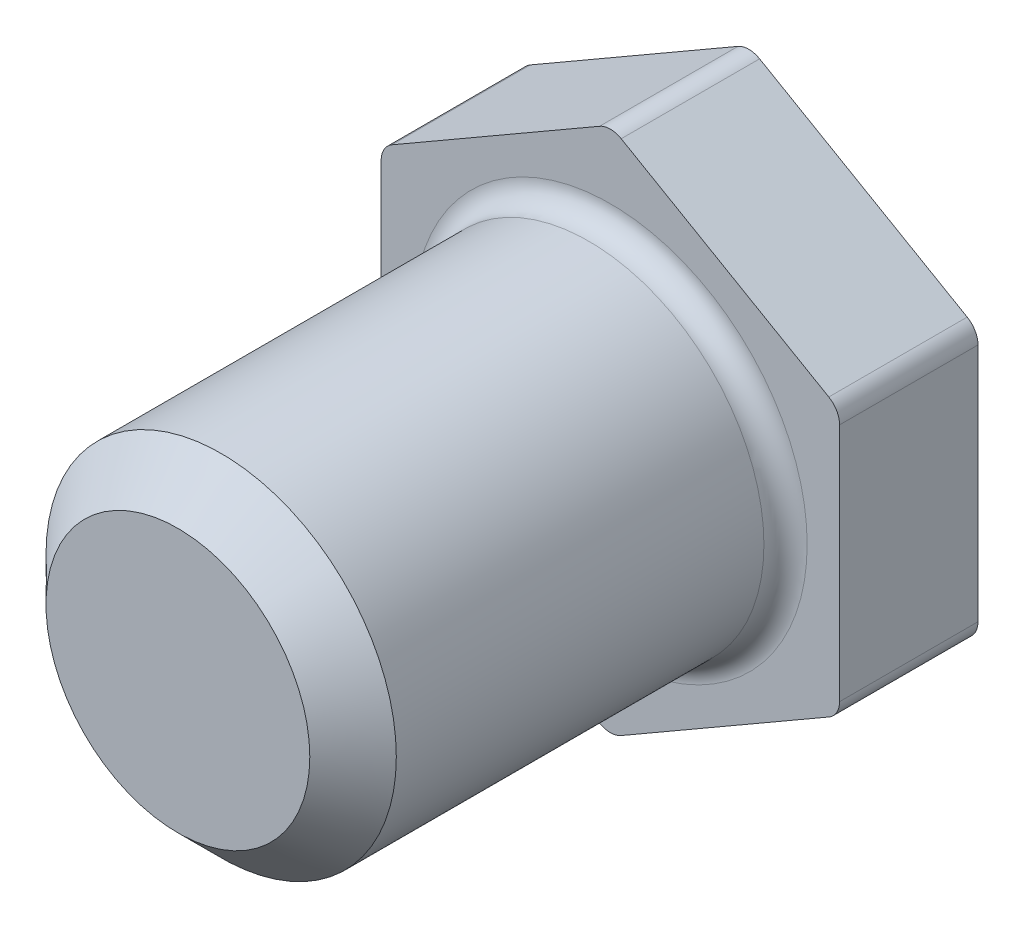
ISO-10303-21;
HEADER;
FILE_DESCRIPTION(('STEP AP214'),'2;1');
FILE_NAME('part.step','',(''),(''),'','','');
FILE_SCHEMA(('AUTOMOTIVE_DESIGN { 1 0 10303 214 1 1 1 1 }'));
ENDSEC;
DATA;
#1=APPLICATION_CONTEXT('core data for automotive mechanical design processes');
#2=APPLICATION_PROTOCOL_DEFINITION('international standard','automotive_design',2000,#1);
#3=PRODUCT_CONTEXT('',#1,'mechanical');
#4=PRODUCT('Part','Part','',(#3));
#5=PRODUCT_RELATED_PRODUCT_CATEGORY('part','',(#4));
#6=PRODUCT_DEFINITION_FORMATION('','',#4);
#7=PRODUCT_DEFINITION_CONTEXT('part definition',#1,'design');
#8=PRODUCT_DEFINITION('design','',#6,#7);
#9=PRODUCT_DEFINITION_SHAPE('','',#8);
#10=(LENGTH_UNIT() NAMED_UNIT(*) SI_UNIT(.MILLI.,.METRE.));
#11=(NAMED_UNIT(*) PLANE_ANGLE_UNIT() SI_UNIT($,.RADIAN.));
#12=(NAMED_UNIT(*) SI_UNIT($,.STERADIAN.) SOLID_ANGLE_UNIT());
#13=UNCERTAINTY_MEASURE_WITH_UNIT(LENGTH_MEASURE(1.E-05),#10,'distance_accuracy_value','');
#14=(GEOMETRIC_REPRESENTATION_CONTEXT(3) GLOBAL_UNCERTAINTY_ASSIGNED_CONTEXT((#13)) GLOBAL_UNIT_ASSIGNED_CONTEXT((#10,
#11,#12)) REPRESENTATION_CONTEXT('',''));
#15=CARTESIAN_POINT('',(0.,0.,0.));
#16=DIRECTION('',(0.,0.,1.));
#17=DIRECTION('',(1.,0.,0.));
#18=AXIS2_PLACEMENT_3D('',#15,#16,#17);
#19=CARTESIAN_POINT('',(5.3,-3.05995642670502,3.2));
#20=DIRECTION('',(-1.,0.,0.));
#21=DIRECTION('',(0.,-1.,0.));
#22=AXIS2_PLACEMENT_3D('',#19,#20,#21);
#23=PLANE('',#22);
#24=DIRECTION('',(0.,1.,0.));
#25=VECTOR('',#24,1.);
#26=CARTESIAN_POINT('',(5.3,-3.05995642670502,3.2));
#27=LINE('',#26,#25);
#28=CARTESIAN_POINT('',(5.3,-2.7712812921102,3.2));
#29=VERTEX_POINT('',#28);
#30=CARTESIAN_POINT('',(5.3,2.77128129211021,3.2));
#31=VERTEX_POINT('',#30);
#32=EDGE_CURVE('E145',#29,#31,#27,.T.);
#33=ORIENTED_EDGE('',*,*,#32,.F.);
#34=DIRECTION('',(0.,0.,-1.));
#35=VECTOR('',#34,1.);
#36=CARTESIAN_POINT('',(5.3,-2.7712812921102,3.2));
#37=LINE('',#36,#35);
#38=CARTESIAN_POINT('',(5.3,-2.7712812921102,0.));
#39=VERTEX_POINT('',#38);
#40=EDGE_CURVE('E159',#29,#39,#37,.T.);
#41=ORIENTED_EDGE('',*,*,#40,.T.);
#42=DIRECTION('',(0.,1.,0.));
#43=VECTOR('',#42,1.);
#44=CARTESIAN_POINT('',(5.3,-3.05995642670502,0.));
#45=LINE('',#44,#43);
#46=CARTESIAN_POINT('',(5.3,2.77128129211021,0.));
#47=VERTEX_POINT('',#46);
#48=EDGE_CURVE('E320',#39,#47,#45,.T.);
#49=ORIENTED_EDGE('',*,*,#48,.T.);
#50=DIRECTION('',(0.,0.,-1.));
#51=VECTOR('',#50,1.);
#52=CARTESIAN_POINT('',(5.3,2.77128129211021,3.2));
#53=LINE('',#52,#51);
#54=EDGE_CURVE('E161',#47,#31,#53,.F.);
#55=ORIENTED_EDGE('',*,*,#54,.T.);
#56=EDGE_LOOP('',(#33,#41,#49,#55));
#57=FACE_BOUND('',#56,.T.);
#58=ADVANCED_FACE('F47',(#57),#23,.F.);
#59=CARTESIAN_POINT('',(5.3,3.05995642670502,3.2));
#60=DIRECTION('',(-0.499999999999999,-0.866025403784439,0.));
#61=DIRECTION('',(0.866025403784439,-0.499999999999999,0.));
#62=AXIS2_PLACEMENT_3D('',#59,#60,#61);
#63=PLANE('',#62);
#64=DIRECTION('',(-0.866025403784439,0.499999999999999,0.));
#65=VECTOR('',#64,1.);
#66=CARTESIAN_POINT('',(5.3,3.05995642670502,3.2));
#67=LINE('',#66,#65);
#68=CARTESIAN_POINT('',(5.05,3.20429399400243,3.2));
#69=VERTEX_POINT('',#68);
#70=CARTESIAN_POINT('',(0.249999999999993,5.97557528611262,3.2));
#71=VERTEX_POINT('',#70);
#72=EDGE_CURVE('E163',#69,#71,#67,.T.);
#73=ORIENTED_EDGE('',*,*,#72,.F.);
#74=DIRECTION('',(0.,0.,-1.));
#75=VECTOR('',#74,1.);
#76=CARTESIAN_POINT('',(5.05,3.20429399400243,3.2));
#77=LINE('',#76,#75);
#78=CARTESIAN_POINT('',(5.05,3.20429399400243,0.));
#79=VERTEX_POINT('',#78);
#80=EDGE_CURVE('E173',#69,#79,#77,.T.);
#81=ORIENTED_EDGE('',*,*,#80,.T.);
#82=DIRECTION('',(-0.866025403784439,0.499999999999999,0.));
#83=VECTOR('',#82,1.);
#84=CARTESIAN_POINT('',(5.3,3.05995642670502,0.));
#85=LINE('',#84,#83);
#86=CARTESIAN_POINT('',(0.249999999999993,5.97557528611262,0.));
#87=VERTEX_POINT('',#86);
#88=EDGE_CURVE('E323',#79,#87,#85,.T.);
#89=ORIENTED_EDGE('',*,*,#88,.T.);
#90=DIRECTION('',(0.,0.,-1.));
#91=VECTOR('',#90,1.);
#92=CARTESIAN_POINT('',(0.249999999999993,5.97557528611262,3.2));
#93=LINE('',#92,#91);
#94=EDGE_CURVE('E169',#87,#71,#93,.F.);
#95=ORIENTED_EDGE('',*,*,#94,.T.);
#96=EDGE_LOOP('',(#73,#81,#89,#95));
#97=FACE_BOUND('',#96,.T.);
#98=ADVANCED_FACE('F197',(#97),#63,.F.);
#99=CARTESIAN_POINT('',(0.,6.11991285341003,3.2));
#100=DIRECTION('',(0.5,-0.866025403784438,0.));
#101=DIRECTION('',(0.866025403784439,0.5,0.));
#102=AXIS2_PLACEMENT_3D('',#99,#100,#101);
#103=PLANE('',#102);
#104=DIRECTION('',(-0.866025403784438,-0.5,0.));
#105=VECTOR('',#104,1.);
#106=CARTESIAN_POINT('',(0.,6.11991285341003,0.));
#107=LINE('',#106,#105);
#108=CARTESIAN_POINT('',(-0.250000000000006,5.97557528611262,0.));
#109=VERTEX_POINT('',#108);
#110=CARTESIAN_POINT('',(-5.05,3.20429399400242,0.));
#111=VERTEX_POINT('',#110);
#112=EDGE_CURVE('E326',#109,#111,#107,.T.);
#113=ORIENTED_EDGE('',*,*,#112,.T.);
#114=DIRECTION('',(0.,0.,-1.));
#115=VECTOR('',#114,1.);
#116=CARTESIAN_POINT('',(-5.05,3.20429399400242,3.2));
#117=LINE('',#116,#115);
#118=CARTESIAN_POINT('',(-5.05,3.20429399400242,3.2));
#119=VERTEX_POINT('',#118);
#120=EDGE_CURVE('E276',#111,#119,#117,.F.);
#121=ORIENTED_EDGE('',*,*,#120,.T.);
#122=DIRECTION('',(-0.866025403784438,-0.5,0.));
#123=VECTOR('',#122,1.);
#124=CARTESIAN_POINT('',(0.,6.11991285341003,3.2));
#125=LINE('',#124,#123);
#126=CARTESIAN_POINT('',(-0.250000000000006,5.97557528611262,3.2));
#127=VERTEX_POINT('',#126);
#128=EDGE_CURVE('E360',#127,#119,#125,.T.);
#129=ORIENTED_EDGE('',*,*,#128,.F.);
#130=DIRECTION('',(0.,0.,-1.));
#131=VECTOR('',#130,1.);
#132=CARTESIAN_POINT('',(-0.250000000000006,5.97557528611262,3.2));
#133=LINE('',#132,#131);
#134=EDGE_CURVE('E272',#127,#109,#133,.T.);
#135=ORIENTED_EDGE('',*,*,#134,.T.);
#136=EDGE_LOOP('',(#113,#121,#129,#135));
#137=FACE_BOUND('',#136,.T.);
#138=ADVANCED_FACE('F202',(#137),#103,.F.);
#139=CARTESIAN_POINT('',(-5.3,3.05995642670502,3.2));
#140=DIRECTION('',(1.,0.,0.));
#141=DIRECTION('',(0.,1.,0.));
#142=AXIS2_PLACEMENT_3D('',#139,#140,#141);
#143=PLANE('',#142);
#144=DIRECTION('',(0.,-1.,0.));
#145=VECTOR('',#144,1.);
#146=CARTESIAN_POINT('',(-5.3,3.05995642670502,3.2));
#147=LINE('',#146,#145);
#148=CARTESIAN_POINT('',(-5.3,2.7712812921102,3.2));
#149=VERTEX_POINT('',#148);
#150=CARTESIAN_POINT('',(-5.3,-2.77128129211021,3.2));
#151=VERTEX_POINT('',#150);
#152=EDGE_CURVE('E316',#149,#151,#147,.T.);
#153=ORIENTED_EDGE('',*,*,#152,.F.);
#154=DIRECTION('',(0.,0.,-1.));
#155=VECTOR('',#154,1.);
#156=CARTESIAN_POINT('',(-5.3,2.7712812921102,3.2));
#157=LINE('',#156,#155);
#158=CARTESIAN_POINT('',(-5.3,2.7712812921102,0.));
#159=VERTEX_POINT('',#158);
#160=EDGE_CURVE('E253',#149,#159,#157,.T.);
#161=ORIENTED_EDGE('',*,*,#160,.T.);
#162=DIRECTION('',(0.,-1.,0.));
#163=VECTOR('',#162,1.);
#164=CARTESIAN_POINT('',(-5.3,3.05995642670502,0.));
#165=LINE('',#164,#163);
#166=CARTESIAN_POINT('',(-5.3,-2.77128129211021,0.));
#167=VERTEX_POINT('',#166);
#168=EDGE_CURVE('E304',#159,#167,#165,.T.);
#169=ORIENTED_EDGE('',*,*,#168,.T.);
#170=DIRECTION('',(0.,0.,-1.));
#171=VECTOR('',#170,1.);
#172=CARTESIAN_POINT('',(-5.3,-2.77128129211021,3.2));
#173=LINE('',#172,#171);
#174=EDGE_CURVE('E250',#167,#151,#173,.F.);
#175=ORIENTED_EDGE('',*,*,#174,.T.);
#176=EDGE_LOOP('',(#153,#161,#169,#175));
#177=FACE_BOUND('',#176,.T.);
#178=ADVANCED_FACE('F334',(#177),#143,.F.);
#179=CARTESIAN_POINT('',(-5.3,-3.05995642670502,3.2));
#180=DIRECTION('',(0.499999999999999,0.866025403784439,0.));
#181=DIRECTION('',(-0.866025403784439,0.499999999999999,0.));
#182=AXIS2_PLACEMENT_3D('',#179,#180,#181);
#183=PLANE('',#182);
#184=DIRECTION('',(0.866025403784439,-0.499999999999999,0.));
#185=VECTOR('',#184,1.);
#186=CARTESIAN_POINT('',(-5.3,-3.05995642670502,3.2));
#187=LINE('',#186,#185);
#188=CARTESIAN_POINT('',(-5.05,-3.20429399400243,3.2));
#189=VERTEX_POINT('',#188);
#190=CARTESIAN_POINT('',(-0.249999999999999,-5.97557528611263,3.2));
#191=VERTEX_POINT('',#190);
#192=EDGE_CURVE('E312',#189,#191,#187,.T.);
#193=ORIENTED_EDGE('',*,*,#192,.F.);
#194=DIRECTION('',(0.,0.,-1.));
#195=VECTOR('',#194,1.);
#196=CARTESIAN_POINT('',(-5.05,-3.20429399400243,3.2));
#197=LINE('',#196,#195);
#198=CARTESIAN_POINT('',(-5.05,-3.20429399400243,0.));
#199=VERTEX_POINT('',#198);
#200=EDGE_CURVE('E282',#189,#199,#197,.T.);
#201=ORIENTED_EDGE('',*,*,#200,.T.);
#202=DIRECTION('',(0.866025403784439,-0.499999999999999,0.));
#203=VECTOR('',#202,1.);
#204=CARTESIAN_POINT('',(-5.3,-3.05995642670502,0.));
#205=LINE('',#204,#203);
#206=CARTESIAN_POINT('',(-0.249999999999999,-5.97557528611263,0.));
#207=VERTEX_POINT('',#206);
#208=EDGE_CURVE('E301',#199,#207,#205,.T.);
#209=ORIENTED_EDGE('',*,*,#208,.T.);
#210=DIRECTION('',(0.,0.,-1.));
#211=VECTOR('',#210,1.);
#212=CARTESIAN_POINT('',(-0.249999999999998,-5.97557528611263,3.2));
#213=LINE('',#212,#211);
#214=EDGE_CURVE('E279',#207,#191,#213,.F.);
#215=ORIENTED_EDGE('',*,*,#214,.T.);
#216=EDGE_LOOP('',(#193,#201,#209,#215));
#217=FACE_BOUND('',#216,.T.);
#218=ADVANCED_FACE('F341',(#217),#183,.F.);
#219=CARTESIAN_POINT('',(0.,-6.11991285341003,3.2));
#220=DIRECTION('',(-0.5,0.866025403784439,0.));
#221=DIRECTION('',(-0.866025403784439,-0.5,0.));
#222=AXIS2_PLACEMENT_3D('',#219,#220,#221);
#223=PLANE('',#222);
#224=DIRECTION('',(0.866025403784439,0.5,0.));
#225=VECTOR('',#224,1.);
#226=CARTESIAN_POINT('',(0.,-6.11991285341003,3.2));
#227=LINE('',#226,#225);
#228=CARTESIAN_POINT('',(0.250000000000002,-5.97557528611263,3.2));
#229=VERTEX_POINT('',#228);
#230=CARTESIAN_POINT('',(5.05,-3.20429399400242,3.2));
#231=VERTEX_POINT('',#230);
#232=EDGE_CURVE('E148',#229,#231,#227,.T.);
#233=ORIENTED_EDGE('',*,*,#232,.F.);
#234=DIRECTION('',(0.,0.,-1.));
#235=VECTOR('',#234,1.);
#236=CARTESIAN_POINT('',(0.250000000000002,-5.97557528611263,3.2));
#237=LINE('',#236,#235);
#238=CARTESIAN_POINT('',(0.250000000000002,-5.97557528611263,0.));
#239=VERTEX_POINT('',#238);
#240=EDGE_CURVE('E175',#229,#239,#237,.T.);
#241=ORIENTED_EDGE('',*,*,#240,.T.);
#242=DIRECTION('',(0.866025403784439,0.5,0.));
#243=VECTOR('',#242,1.);
#244=CARTESIAN_POINT('',(0.,-6.11991285341003,0.));
#245=LINE('',#244,#243);
#246=CARTESIAN_POINT('',(5.05,-3.20429399400242,0.));
#247=VERTEX_POINT('',#246);
#248=EDGE_CURVE('E164',#239,#247,#245,.T.);
#249=ORIENTED_EDGE('',*,*,#248,.T.);
#250=DIRECTION('',(0.,0.,-1.));
#251=VECTOR('',#250,1.);
#252=CARTESIAN_POINT('',(5.05,-3.20429399400242,3.2));
#253=LINE('',#252,#251);
#254=EDGE_CURVE('E286',#247,#231,#253,.F.);
#255=ORIENTED_EDGE('',*,*,#254,.T.);
#256=EDGE_LOOP('',(#233,#241,#249,#255));
#257=FACE_BOUND('',#256,.T.);
#258=ADVANCED_FACE('F294',(#257),#223,.F.);
#259=CARTESIAN_POINT('',(0.,0.,3.2));
#260=DIRECTION('',(0.,0.,1.));
#261=DIRECTION('',(1.,0.,0.));
#262=AXIS2_PLACEMENT_3D('',#259,#260,#261);
#263=PLANE('',#262);
#264=CARTESIAN_POINT('',(0.,0.,3.2));
#265=DIRECTION('',(0.,0.,1.));
#266=DIRECTION('',(1.,0.,0.));
#267=AXIS2_PLACEMENT_3D('',#264,#265,#266);
#268=CIRCLE('',#267,4.55);
#269=CARTESIAN_POINT('',(4.55,0.,3.2));
#270=VERTEX_POINT('',#269);
#271=EDGE_CURVE('E246',#270,#270,#268,.F.);
#272=ORIENTED_EDGE('',*,*,#271,.T.);
#273=EDGE_LOOP('',(#272));
#274=FACE_BOUND('',#273,.T.);
#275=ORIENTED_EDGE('',*,*,#128,.T.);
#276=CARTESIAN_POINT('',(-4.8,2.7712812921102,3.2));
#277=DIRECTION('',(0.,0.,1.));
#278=DIRECTION('',(1.,0.,0.));
#279=AXIS2_PLACEMENT_3D('',#276,#277,#278);
#280=CIRCLE('',#279,0.5);
#281=EDGE_CURVE('E243',#119,#149,#280,.T.);
#282=ORIENTED_EDGE('',*,*,#281,.T.);
#283=ORIENTED_EDGE('',*,*,#152,.T.);
#284=CARTESIAN_POINT('',(-4.8,-2.77128129211021,3.2));
#285=DIRECTION('',(0.,0.,1.));
#286=DIRECTION('',(1.,0.,0.));
#287=AXIS2_PLACEMENT_3D('',#284,#285,#286);
#288=CIRCLE('',#287,0.5);
#289=EDGE_CURVE('E240',#151,#189,#288,.T.);
#290=ORIENTED_EDGE('',*,*,#289,.T.);
#291=ORIENTED_EDGE('',*,*,#192,.T.);
#292=CARTESIAN_POINT('',(0.,-5.54256258422041,3.2));
#293=DIRECTION('',(0.,0.,1.));
#294=DIRECTION('',(1.,0.,0.));
#295=AXIS2_PLACEMENT_3D('',#292,#293,#294);
#296=CIRCLE('',#295,0.5);
#297=EDGE_CURVE('E153',#191,#229,#296,.T.);
#298=ORIENTED_EDGE('',*,*,#297,.T.);
#299=ORIENTED_EDGE('',*,*,#232,.T.);
#300=CARTESIAN_POINT('',(4.8,-2.7712812921102,3.2));
#301=DIRECTION('',(0.,0.,1.));
#302=DIRECTION('',(1.,0.,0.));
#303=AXIS2_PLACEMENT_3D('',#300,#301,#302);
#304=CIRCLE('',#303,0.5);
#305=EDGE_CURVE('E141',#231,#29,#304,.T.);
#306=ORIENTED_EDGE('',*,*,#305,.T.);
#307=ORIENTED_EDGE('',*,*,#32,.T.);
#308=CARTESIAN_POINT('',(4.8,2.77128129211021,3.2));
#309=DIRECTION('',(0.,0.,1.));
#310=DIRECTION('',(1.,0.,0.));
#311=AXIS2_PLACEMENT_3D('',#308,#309,#310);
#312=CIRCLE('',#311,0.5);
#313=EDGE_CURVE('E154',#31,#69,#312,.T.);
#314=ORIENTED_EDGE('',*,*,#313,.T.);
#315=ORIENTED_EDGE('',*,*,#72,.T.);
#316=CARTESIAN_POINT('',(0.,5.5425625842204,3.2));
#317=DIRECTION('',(0.,0.,1.));
#318=DIRECTION('',(1.,0.,0.));
#319=AXIS2_PLACEMENT_3D('',#316,#317,#318);
#320=CIRCLE('',#319,0.5);
#321=EDGE_CURVE('E231',#71,#127,#320,.T.);
#322=ORIENTED_EDGE('',*,*,#321,.T.);
#323=EDGE_LOOP('',(#275,#282,#283,#290,#291,#298,#299,#306,#307,#314,#315,#322));
#324=FACE_BOUND('',#323,.T.);
#325=ADVANCED_FACE('F144',(#274,#324),#263,.T.);
#326=CARTESIAN_POINT('',(0.,0.,0.));
#327=DIRECTION('',(0.,0.,1.));
#328=DIRECTION('',(1.,0.,0.));
#329=AXIS2_PLACEMENT_3D('',#326,#327,#328);
#330=PLANE('',#329);
#331=ORIENTED_EDGE('',*,*,#168,.F.);
#332=CARTESIAN_POINT('',(-4.8,2.7712812921102,0.));
#333=DIRECTION('',(0.,0.,1.));
#334=DIRECTION('',(1.,0.,0.));
#335=AXIS2_PLACEMENT_3D('',#332,#333,#334);
#336=CIRCLE('',#335,0.5);
#337=EDGE_CURVE('E269',#159,#111,#336,.F.);
#338=ORIENTED_EDGE('',*,*,#337,.T.);
#339=ORIENTED_EDGE('',*,*,#112,.F.);
#340=CARTESIAN_POINT('',(0.,5.5425625842204,0.));
#341=DIRECTION('',(0.,0.,1.));
#342=DIRECTION('',(1.,0.,0.));
#343=AXIS2_PLACEMENT_3D('',#340,#341,#342);
#344=CIRCLE('',#343,0.5);
#345=EDGE_CURVE('E64',#109,#87,#344,.F.);
#346=ORIENTED_EDGE('',*,*,#345,.T.);
#347=ORIENTED_EDGE('',*,*,#88,.F.);
#348=CARTESIAN_POINT('',(4.8,2.77128129211021,0.));
#349=DIRECTION('',(0.,0.,1.));
#350=DIRECTION('',(1.,0.,0.));
#351=AXIS2_PLACEMENT_3D('',#348,#349,#350);
#352=CIRCLE('',#351,0.5);
#353=EDGE_CURVE('E72',#79,#47,#352,.F.);
#354=ORIENTED_EDGE('',*,*,#353,.T.);
#355=ORIENTED_EDGE('',*,*,#48,.F.);
#356=CARTESIAN_POINT('',(4.8,-2.7712812921102,0.));
#357=DIRECTION('',(0.,0.,1.));
#358=DIRECTION('',(1.,0.,0.));
#359=AXIS2_PLACEMENT_3D('',#356,#357,#358);
#360=CIRCLE('',#359,0.5);
#361=EDGE_CURVE('E167',#39,#247,#360,.F.);
#362=ORIENTED_EDGE('',*,*,#361,.T.);
#363=ORIENTED_EDGE('',*,*,#248,.F.);
#364=CARTESIAN_POINT('',(0.,-5.54256258422041,0.));
#365=DIRECTION('',(0.,0.,1.));
#366=DIRECTION('',(1.,0.,0.));
#367=AXIS2_PLACEMENT_3D('',#364,#365,#366);
#368=CIRCLE('',#367,0.5);
#369=EDGE_CURVE('E263',#239,#207,#368,.F.);
#370=ORIENTED_EDGE('',*,*,#369,.T.);
#371=ORIENTED_EDGE('',*,*,#208,.F.);
#372=CARTESIAN_POINT('',(-4.8,-2.77128129211021,0.));
#373=DIRECTION('',(0.,0.,1.));
#374=DIRECTION('',(1.,0.,0.));
#375=AXIS2_PLACEMENT_3D('',#372,#373,#374);
#376=CIRCLE('',#375,0.5);
#377=EDGE_CURVE('E266',#199,#167,#376,.F.);
#378=ORIENTED_EDGE('',*,*,#377,.T.);
#379=EDGE_LOOP('',(#331,#338,#339,#346,#347,#354,#355,#362,#363,#370,#371,#378));
#380=FACE_BOUND('',#379,.T.);
#381=ADVANCED_FACE('F297',(#380),#330,.F.);
#382=CARTESIAN_POINT('',(0.,0.,13.2));
#383=DIRECTION('',(0.,0.,-1.));
#384=DIRECTION('',(-1.,0.,0.));
#385=AXIS2_PLACEMENT_3D('',#382,#383,#384);
#386=CYLINDRICAL_SURFACE('',#385,4.05);
#387=CARTESIAN_POINT('',(0.,0.,12.2));
#388=DIRECTION('',(0.,0.,1.));
#389=DIRECTION('',(1.,0.,0.));
#390=AXIS2_PLACEMENT_3D('',#387,#388,#389);
#391=CIRCLE('',#390,4.05);
#392=CARTESIAN_POINT('',(4.05,0.,12.2));
#393=VERTEX_POINT('',#392);
#394=EDGE_CURVE('E11',#393,#393,#391,.F.);
#395=ORIENTED_EDGE('',*,*,#394,.T.);
#396=EDGE_LOOP('',(#395));
#397=FACE_BOUND('',#396,.T.);
#398=CARTESIAN_POINT('',(0.,0.,3.7));
#399=DIRECTION('',(0.,0.,1.));
#400=DIRECTION('',(1.,0.,0.));
#401=AXIS2_PLACEMENT_3D('',#398,#399,#400);
#402=CIRCLE('',#401,4.05);
#403=CARTESIAN_POINT('',(4.05,0.,3.7));
#404=VERTEX_POINT('',#403);
#405=EDGE_CURVE('E234',#404,#404,#402,.T.);
#406=ORIENTED_EDGE('',*,*,#405,.T.);
#407=EDGE_LOOP('',(#406));
#408=FACE_BOUND('',#407,.T.);
#409=ADVANCED_FACE('F404',(#397,#408),#386,.T.);
#410=CARTESIAN_POINT('',(0.,0.,13.2));
#411=DIRECTION('',(0.,0.,1.));
#412=DIRECTION('',(1.,0.,0.));
#413=AXIS2_PLACEMENT_3D('',#410,#411,#412);
#414=PLANE('',#413);
#415=CARTESIAN_POINT('',(0.,0.,13.2));
#416=DIRECTION('',(0.,0.,1.));
#417=DIRECTION('',(1.,0.,0.));
#418=AXIS2_PLACEMENT_3D('',#415,#416,#417);
#419=CIRCLE('',#418,3.05);
#420=CARTESIAN_POINT('',(3.05,0.,13.2));
#421=VERTEX_POINT('',#420);
#422=EDGE_CURVE('E57',#421,#421,#419,.T.);
#423=ORIENTED_EDGE('',*,*,#422,.T.);
#424=EDGE_LOOP('',(#423));
#425=FACE_BOUND('',#424,.T.);
#426=ADVANCED_FACE('F184',(#425),#414,.T.);
#427=CARTESIAN_POINT('',(0.,0.,3.7));
#428=DIRECTION('',(0.,0.,1.));
#429=DIRECTION('',(1.,0.,0.));
#430=AXIS2_PLACEMENT_3D('',#427,#428,#429);
#431=TOROIDAL_SURFACE('',#430,4.55,0.5);
#432=ORIENTED_EDGE('',*,*,#271,.F.);
#433=EDGE_LOOP('',(#432));
#434=FACE_BOUND('',#433,.T.);
#435=ORIENTED_EDGE('',*,*,#405,.F.);
#436=EDGE_LOOP('',(#435));
#437=FACE_BOUND('',#436,.T.);
#438=ADVANCED_FACE('F207',(#434,#437),#431,.F.);
#439=CARTESIAN_POINT('',(-4.8,2.7712812921102,3.2));
#440=DIRECTION('',(0.,0.,-1.));
#441=DIRECTION('',(-1.,0.,0.));
#442=AXIS2_PLACEMENT_3D('',#439,#440,#441);
#443=CYLINDRICAL_SURFACE('',#442,0.5);
#444=ORIENTED_EDGE('',*,*,#281,.F.);
#445=ORIENTED_EDGE('',*,*,#120,.F.);
#446=ORIENTED_EDGE('',*,*,#337,.F.);
#447=ORIENTED_EDGE('',*,*,#160,.F.);
#448=EDGE_LOOP('',(#444,#445,#446,#447));
#449=FACE_BOUND('',#448,.T.);
#450=ADVANCED_FACE('F210',(#449),#443,.T.);
#451=CARTESIAN_POINT('',(-4.8,-2.77128129211021,3.2));
#452=DIRECTION('',(0.,0.,-1.));
#453=DIRECTION('',(-1.,0.,0.));
#454=AXIS2_PLACEMENT_3D('',#451,#452,#453);
#455=CYLINDRICAL_SURFACE('',#454,0.5);
#456=ORIENTED_EDGE('',*,*,#289,.F.);
#457=ORIENTED_EDGE('',*,*,#174,.F.);
#458=ORIENTED_EDGE('',*,*,#377,.F.);
#459=ORIENTED_EDGE('',*,*,#200,.F.);
#460=EDGE_LOOP('',(#456,#457,#458,#459));
#461=FACE_BOUND('',#460,.T.);
#462=ADVANCED_FACE('F214',(#461),#455,.T.);
#463=CARTESIAN_POINT('',(0.,-5.54256258422041,3.2));
#464=DIRECTION('',(0.,0.,-1.));
#465=DIRECTION('',(-1.,0.,0.));
#466=AXIS2_PLACEMENT_3D('',#463,#464,#465);
#467=CYLINDRICAL_SURFACE('',#466,0.5);
#468=ORIENTED_EDGE('',*,*,#297,.F.);
#469=ORIENTED_EDGE('',*,*,#214,.F.);
#470=ORIENTED_EDGE('',*,*,#369,.F.);
#471=ORIENTED_EDGE('',*,*,#240,.F.);
#472=EDGE_LOOP('',(#468,#469,#470,#471));
#473=FACE_BOUND('',#472,.T.);
#474=ADVANCED_FACE('F218',(#473),#467,.T.);
#475=CARTESIAN_POINT('',(4.8,-2.7712812921102,3.2));
#476=DIRECTION('',(0.,0.,-1.));
#477=DIRECTION('',(-1.,0.,0.));
#478=AXIS2_PLACEMENT_3D('',#475,#476,#477);
#479=CYLINDRICAL_SURFACE('',#478,0.5);
#480=ORIENTED_EDGE('',*,*,#305,.F.);
#481=ORIENTED_EDGE('',*,*,#254,.F.);
#482=ORIENTED_EDGE('',*,*,#361,.F.);
#483=ORIENTED_EDGE('',*,*,#40,.F.);
#484=EDGE_LOOP('',(#480,#481,#482,#483));
#485=FACE_BOUND('',#484,.T.);
#486=ADVANCED_FACE('F166',(#485),#479,.T.);
#487=CARTESIAN_POINT('',(4.8,2.77128129211021,3.2));
#488=DIRECTION('',(0.,0.,-1.));
#489=DIRECTION('',(-1.,0.,0.));
#490=AXIS2_PLACEMENT_3D('',#487,#488,#489);
#491=CYLINDRICAL_SURFACE('',#490,0.5);
#492=ORIENTED_EDGE('',*,*,#313,.F.);
#493=ORIENTED_EDGE('',*,*,#54,.F.);
#494=ORIENTED_EDGE('',*,*,#353,.F.);
#495=ORIENTED_EDGE('',*,*,#80,.F.);
#496=EDGE_LOOP('',(#492,#493,#494,#495));
#497=FACE_BOUND('',#496,.T.);
#498=ADVANCED_FACE('F193',(#497),#491,.T.);
#499=CARTESIAN_POINT('',(0.,5.5425625842204,3.2));
#500=DIRECTION('',(0.,0.,-1.));
#501=DIRECTION('',(-1.,0.,0.));
#502=AXIS2_PLACEMENT_3D('',#499,#500,#501);
#503=CYLINDRICAL_SURFACE('',#502,0.5);
#504=ORIENTED_EDGE('',*,*,#321,.F.);
#505=ORIENTED_EDGE('',*,*,#94,.F.);
#506=ORIENTED_EDGE('',*,*,#345,.F.);
#507=ORIENTED_EDGE('',*,*,#134,.F.);
#508=EDGE_LOOP('',(#504,#505,#506,#507));
#509=FACE_BOUND('',#508,.T.);
#510=ADVANCED_FACE('F187',(#509),#503,.T.);
#511=CARTESIAN_POINT('',(0.,0.,13.2));
#512=DIRECTION('',(0.,0.,-1.));
#513=DIRECTION('',(-1.,0.,0.));
#514=AXIS2_PLACEMENT_3D('',#511,#512,#513);
#515=CONICAL_SURFACE('',#514,3.05,0.785398163397447);
#516=ORIENTED_EDGE('',*,*,#394,.F.);
#517=EDGE_LOOP('',(#516));
#518=FACE_BOUND('',#517,.T.);
#519=ORIENTED_EDGE('',*,*,#422,.F.);
#520=EDGE_LOOP('',(#519));
#521=FACE_BOUND('',#520,.T.);
#522=ADVANCED_FACE('F50',(#518,#521),#515,.T.);
#523=CLOSED_SHELL('',(#58,#98,#138,#178,#218,#258,#325,#381,#409,#426,#438,#450,#462,#474,#486,
#498,#510,#522));
#524=MANIFOLD_SOLID_BREP('B2',#523);
#525=ADVANCED_BREP_SHAPE_REPRESENTATION('',(#18,#524),#14);
#526=SHAPE_DEFINITION_REPRESENTATION(#9,#525);
ENDSEC;
END-ISO-10303-21;
